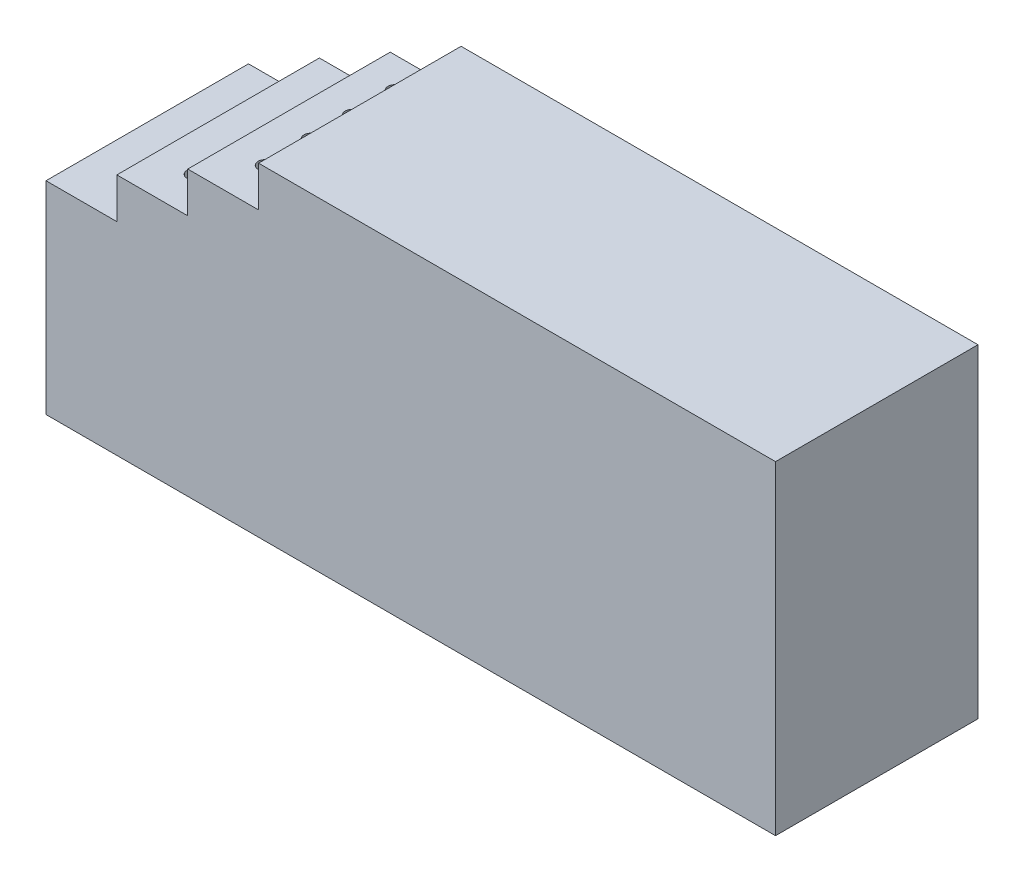
ISO-10303-21;
HEADER;
FILE_DESCRIPTION(('STEP AP214'),'2;1');
FILE_NAME('part.step','',(''),(''),'','','');
FILE_SCHEMA(('AUTOMOTIVE_DESIGN { 1 0 10303 214 1 1 1 1 }'));
ENDSEC;
DATA;
#1=APPLICATION_CONTEXT('core data for automotive mechanical design processes');
#2=APPLICATION_PROTOCOL_DEFINITION('international standard','automotive_design',2000,#1);
#3=PRODUCT_CONTEXT('',#1,'mechanical');
#4=PRODUCT('Part','Part','',(#3));
#5=PRODUCT_RELATED_PRODUCT_CATEGORY('part','',(#4));
#6=PRODUCT_DEFINITION_FORMATION('','',#4);
#7=PRODUCT_DEFINITION_CONTEXT('part definition',#1,'design');
#8=PRODUCT_DEFINITION('design','',#6,#7);
#9=PRODUCT_DEFINITION_SHAPE('','',#8);
#10=(LENGTH_UNIT() NAMED_UNIT(*) SI_UNIT(.MILLI.,.METRE.));
#11=(NAMED_UNIT(*) PLANE_ANGLE_UNIT() SI_UNIT($,.RADIAN.));
#12=(NAMED_UNIT(*) SI_UNIT($,.STERADIAN.) SOLID_ANGLE_UNIT());
#13=UNCERTAINTY_MEASURE_WITH_UNIT(LENGTH_MEASURE(1.E-05),#10,'distance_accuracy_value','');
#14=(GEOMETRIC_REPRESENTATION_CONTEXT(3) GLOBAL_UNCERTAINTY_ASSIGNED_CONTEXT((#13)) GLOBAL_UNIT_ASSIGNED_CONTEXT((#10,
#11,#12)) REPRESENTATION_CONTEXT('',''));
#15=CARTESIAN_POINT('',(0.,0.,0.));
#16=DIRECTION('',(0.,0.,1.));
#17=DIRECTION('',(1.,0.,0.));
#18=AXIS2_PLACEMENT_3D('',#15,#16,#17);
#19=CARTESIAN_POINT('',(0.,100.,-100.));
#20=DIRECTION('',(0.,0.,-1.));
#21=DIRECTION('',(-1.,0.,0.));
#22=AXIS2_PLACEMENT_3D('',#19,#20,#21);
#23=PLANE('',#22);
#24=DIRECTION('',(1.,0.,0.));
#25=VECTOR('',#24,1.);
#26=CARTESIAN_POINT('',(0.,0.,-100.));
#27=LINE('',#26,#25);
#28=CARTESIAN_POINT('',(0.,0.,-100.));
#29=VERTEX_POINT('',#28);
#30=CARTESIAN_POINT('',(360.279005498684,0.,-100.));
#31=VERTEX_POINT('',#30);
#32=EDGE_CURVE('E99',#29,#31,#27,.T.);
#33=ORIENTED_EDGE('',*,*,#32,.F.);
#34=DIRECTION('',(0.,-1.,0.));
#35=VECTOR('',#34,1.);
#36=CARTESIAN_POINT('',(0.,100.,-100.));
#37=LINE('',#36,#35);
#38=CARTESIAN_POINT('',(0.,100.,-100.));
#39=VERTEX_POINT('',#38);
#40=EDGE_CURVE('E11',#39,#29,#37,.T.);
#41=ORIENTED_EDGE('',*,*,#40,.F.);
#42=DIRECTION('',(1.,0.,0.));
#43=VECTOR('',#42,1.);
#44=CARTESIAN_POINT('',(0.,100.,-100.));
#45=LINE('',#44,#43);
#46=CARTESIAN_POINT('',(35.,100.,-100.));
#47=VERTEX_POINT('',#46);
#48=EDGE_CURVE('E82',#39,#47,#45,.T.);
#49=ORIENTED_EDGE('',*,*,#48,.T.);
#50=DIRECTION('',(0.,-1.,0.));
#51=VECTOR('',#50,1.);
#52=CARTESIAN_POINT('',(35.,120.,-100.));
#53=LINE('',#52,#51);
#54=CARTESIAN_POINT('',(35.,120.,-100.));
#55=VERTEX_POINT('',#54);
#56=EDGE_CURVE('E92',#55,#47,#53,.T.);
#57=ORIENTED_EDGE('',*,*,#56,.F.);
#58=DIRECTION('',(1.,0.,0.));
#59=VECTOR('',#58,1.);
#60=CARTESIAN_POINT('',(0.,120.,-100.));
#61=LINE('',#60,#59);
#62=CARTESIAN_POINT('',(70.,120.,-100.));
#63=VERTEX_POINT('',#62);
#64=EDGE_CURVE('E323',#55,#63,#61,.T.);
#65=ORIENTED_EDGE('',*,*,#64,.T.);
#66=DIRECTION('',(0.,-1.,0.));
#67=VECTOR('',#66,1.);
#68=CARTESIAN_POINT('',(70.,140.,-100.));
#69=LINE('',#68,#67);
#70=CARTESIAN_POINT('',(70.,140.,-100.));
#71=VERTEX_POINT('',#70);
#72=EDGE_CURVE('E317',#71,#63,#69,.T.);
#73=ORIENTED_EDGE('',*,*,#72,.F.);
#74=DIRECTION('',(1.,0.,0.));
#75=VECTOR('',#74,1.);
#76=CARTESIAN_POINT('',(0.,140.,-100.));
#77=LINE('',#76,#75);
#78=CARTESIAN_POINT('',(105.,140.,-100.));
#79=VERTEX_POINT('',#78);
#80=EDGE_CURVE('E305',#71,#79,#77,.T.);
#81=ORIENTED_EDGE('',*,*,#80,.T.);
#82=DIRECTION('',(0.,-1.,0.));
#83=VECTOR('',#82,1.);
#84=CARTESIAN_POINT('',(105.,160.,-100.));
#85=LINE('',#84,#83);
#86=CARTESIAN_POINT('',(105.,160.,-100.));
#87=VERTEX_POINT('',#86);
#88=EDGE_CURVE('E299',#87,#79,#85,.T.);
#89=ORIENTED_EDGE('',*,*,#88,.F.);
#90=DIRECTION('',(1.,0.,0.));
#91=VECTOR('',#90,1.);
#92=CARTESIAN_POINT('',(0.,160.,-100.));
#93=LINE('',#92,#91);
#94=CARTESIAN_POINT('',(360.279005498684,160.,-100.));
#95=VERTEX_POINT('',#94);
#96=EDGE_CURVE('E287',#87,#95,#93,.T.);
#97=ORIENTED_EDGE('',*,*,#96,.T.);
#98=DIRECTION('',(0.,-1.,0.));
#99=VECTOR('',#98,1.);
#100=CARTESIAN_POINT('',(360.279005498684,160.,-100.));
#101=LINE('',#100,#99);
#102=EDGE_CURVE('E281',#95,#31,#101,.T.);
#103=ORIENTED_EDGE('',*,*,#102,.T.);
#104=EDGE_LOOP('',(#33,#41,#49,#57,#65,#73,#81,#89,#97,#103));
#105=FACE_BOUND('',#104,.T.);
#106=ADVANCED_FACE('F42',(#105),#23,.T.);
#107=CARTESIAN_POINT('',(0.,100.,0.));
#108=DIRECTION('',(-1.,0.,0.));
#109=DIRECTION('',(0.,0.,1.));
#110=AXIS2_PLACEMENT_3D('',#107,#108,#109);
#111=PLANE('',#110);
#112=DIRECTION('',(0.,0.,-1.));
#113=VECTOR('',#112,1.);
#114=CARTESIAN_POINT('',(0.,0.,0.));
#115=LINE('',#114,#113);
#116=CARTESIAN_POINT('',(0.,0.,0.));
#117=VERTEX_POINT('',#116);
#118=EDGE_CURVE('E103',#117,#29,#115,.T.);
#119=ORIENTED_EDGE('',*,*,#118,.F.);
#120=DIRECTION('',(0.,-1.,0.));
#121=VECTOR('',#120,1.);
#122=CARTESIAN_POINT('',(0.,100.,0.));
#123=LINE('',#122,#121);
#124=CARTESIAN_POINT('',(0.,100.,0.));
#125=VERTEX_POINT('',#124);
#126=EDGE_CURVE('E50',#125,#117,#123,.T.);
#127=ORIENTED_EDGE('',*,*,#126,.F.);
#128=DIRECTION('',(0.,0.,-1.));
#129=VECTOR('',#128,1.);
#130=CARTESIAN_POINT('',(0.,100.,0.));
#131=LINE('',#130,#129);
#132=EDGE_CURVE('E94',#125,#39,#131,.T.);
#133=ORIENTED_EDGE('',*,*,#132,.T.);
#134=ORIENTED_EDGE('',*,*,#40,.T.);
#135=EDGE_LOOP('',(#119,#127,#133,#134));
#136=FACE_BOUND('',#135,.T.);
#137=ADVANCED_FACE('F125',(#136),#111,.T.);
#138=CARTESIAN_POINT('',(0.,100.,0.));
#139=DIRECTION('',(0.,0.,-1.));
#140=DIRECTION('',(-1.,0.,0.));
#141=AXIS2_PLACEMENT_3D('',#138,#139,#140);
#142=PLANE('',#141);
#143=DIRECTION('',(1.,0.,0.));
#144=VECTOR('',#143,1.);
#145=CARTESIAN_POINT('',(0.,0.,0.));
#146=LINE('',#145,#144);
#147=CARTESIAN_POINT('',(360.279005498684,0.,0.));
#148=VERTEX_POINT('',#147);
#149=EDGE_CURVE('E87',#117,#148,#146,.T.);
#150=ORIENTED_EDGE('',*,*,#149,.T.);
#151=DIRECTION('',(0.,-1.,0.));
#152=VECTOR('',#151,1.);
#153=CARTESIAN_POINT('',(360.279005498684,160.,0.));
#154=LINE('',#153,#152);
#155=CARTESIAN_POINT('',(360.279005498684,160.,0.));
#156=VERTEX_POINT('',#155);
#157=EDGE_CURVE('E285',#156,#148,#154,.T.);
#158=ORIENTED_EDGE('',*,*,#157,.F.);
#159=DIRECTION('',(1.,0.,0.));
#160=VECTOR('',#159,1.);
#161=CARTESIAN_POINT('',(0.,160.,0.));
#162=LINE('',#161,#160);
#163=CARTESIAN_POINT('',(105.,160.,0.));
#164=VERTEX_POINT('',#163);
#165=EDGE_CURVE('E293',#164,#156,#162,.T.);
#166=ORIENTED_EDGE('',*,*,#165,.F.);
#167=DIRECTION('',(0.,-1.,0.));
#168=VECTOR('',#167,1.);
#169=CARTESIAN_POINT('',(105.,160.,0.));
#170=LINE('',#169,#168);
#171=CARTESIAN_POINT('',(105.,140.,0.));
#172=VERTEX_POINT('',#171);
#173=EDGE_CURVE('E296',#164,#172,#170,.T.);
#174=ORIENTED_EDGE('',*,*,#173,.T.);
#175=DIRECTION('',(1.,0.,0.));
#176=VECTOR('',#175,1.);
#177=CARTESIAN_POINT('',(0.,140.,0.));
#178=LINE('',#177,#176);
#179=CARTESIAN_POINT('',(70.,140.,0.));
#180=VERTEX_POINT('',#179);
#181=EDGE_CURVE('E311',#180,#172,#178,.T.);
#182=ORIENTED_EDGE('',*,*,#181,.F.);
#183=DIRECTION('',(0.,-1.,0.));
#184=VECTOR('',#183,1.);
#185=CARTESIAN_POINT('',(70.,140.,0.));
#186=LINE('',#185,#184);
#187=CARTESIAN_POINT('',(70.,120.,0.));
#188=VERTEX_POINT('',#187);
#189=EDGE_CURVE('E314',#180,#188,#186,.T.);
#190=ORIENTED_EDGE('',*,*,#189,.T.);
#191=DIRECTION('',(1.,0.,0.));
#192=VECTOR('',#191,1.);
#193=CARTESIAN_POINT('',(0.,120.,0.));
#194=LINE('',#193,#192);
#195=CARTESIAN_POINT('',(35.,120.,0.));
#196=VERTEX_POINT('',#195);
#197=EDGE_CURVE('E105',#196,#188,#194,.T.);
#198=ORIENTED_EDGE('',*,*,#197,.F.);
#199=DIRECTION('',(0.,-1.,0.));
#200=VECTOR('',#199,1.);
#201=CARTESIAN_POINT('',(35.,120.,0.));
#202=LINE('',#201,#200);
#203=CARTESIAN_POINT('',(35.,100.,0.));
#204=VERTEX_POINT('',#203);
#205=EDGE_CURVE('E100',#196,#204,#202,.T.);
#206=ORIENTED_EDGE('',*,*,#205,.T.);
#207=DIRECTION('',(1.,0.,0.));
#208=VECTOR('',#207,1.);
#209=CARTESIAN_POINT('',(0.,100.,0.));
#210=LINE('',#209,#208);
#211=EDGE_CURVE('E72',#125,#204,#210,.T.);
#212=ORIENTED_EDGE('',*,*,#211,.F.);
#213=ORIENTED_EDGE('',*,*,#126,.T.);
#214=EDGE_LOOP('',(#150,#158,#166,#174,#182,#190,#198,#206,#212,#213));
#215=FACE_BOUND('',#214,.T.);
#216=ADVANCED_FACE('F116',(#215),#142,.F.);
#217=CARTESIAN_POINT('',(0.,100.,0.));
#218=DIRECTION('',(0.,1.,0.));
#219=DIRECTION('',(0.,0.,1.));
#220=AXIS2_PLACEMENT_3D('',#217,#218,#219);
#221=PLANE('',#220);
#222=DIRECTION('',(0.,0.,1.));
#223=VECTOR('',#222,1.);
#224=CARTESIAN_POINT('',(35.,100.,0.));
#225=LINE('',#224,#223);
#226=EDGE_CURVE('E79',#47,#204,#225,.T.);
#227=ORIENTED_EDGE('',*,*,#226,.F.);
#228=ORIENTED_EDGE('',*,*,#48,.F.);
#229=ORIENTED_EDGE('',*,*,#132,.F.);
#230=ORIENTED_EDGE('',*,*,#211,.T.);
#231=EDGE_LOOP('',(#227,#228,#229,#230));
#232=FACE_BOUND('',#231,.T.);
#233=ADVANCED_FACE('F81',(#232),#221,.T.);
#234=CARTESIAN_POINT('',(0.,0.,0.));
#235=DIRECTION('',(0.,1.,0.));
#236=DIRECTION('',(0.,0.,1.));
#237=AXIS2_PLACEMENT_3D('',#234,#235,#236);
#238=PLANE('',#237);
#239=ORIENTED_EDGE('',*,*,#32,.T.);
#240=DIRECTION('',(0.,0.,-1.));
#241=VECTOR('',#240,1.);
#242=CARTESIAN_POINT('',(360.279005498684,0.,0.));
#243=LINE('',#242,#241);
#244=EDGE_CURVE('E123',#148,#31,#243,.T.);
#245=ORIENTED_EDGE('',*,*,#244,.F.);
#246=ORIENTED_EDGE('',*,*,#149,.F.);
#247=ORIENTED_EDGE('',*,*,#118,.T.);
#248=EDGE_LOOP('',(#239,#245,#246,#247));
#249=FACE_BOUND('',#248,.T.);
#250=ADVANCED_FACE('F121',(#249),#238,.F.);
#251=CARTESIAN_POINT('',(35.,120.,0.));
#252=DIRECTION('',(1.,0.,0.));
#253=DIRECTION('',(0.,0.,-1.));
#254=AXIS2_PLACEMENT_3D('',#251,#252,#253);
#255=PLANE('',#254);
#256=ORIENTED_EDGE('',*,*,#56,.T.);
#257=ORIENTED_EDGE('',*,*,#226,.T.);
#258=ORIENTED_EDGE('',*,*,#205,.F.);
#259=DIRECTION('',(0.,0.,1.));
#260=VECTOR('',#259,1.);
#261=CARTESIAN_POINT('',(35.,120.,0.));
#262=LINE('',#261,#260);
#263=EDGE_CURVE('E97',#55,#196,#262,.T.);
#264=ORIENTED_EDGE('',*,*,#263,.F.);
#265=EDGE_LOOP('',(#256,#257,#258,#264));
#266=FACE_BOUND('',#265,.T.);
#267=ADVANCED_FACE('F96',(#266),#255,.F.);
#268=CARTESIAN_POINT('',(0.,120.,0.));
#269=DIRECTION('',(0.,1.,0.));
#270=DIRECTION('',(0.,0.,1.));
#271=AXIS2_PLACEMENT_3D('',#268,#269,#270);
#272=PLANE('',#271);
#273=CARTESIAN_POINT('',(53.8591113138978,120.,-83.4583906344508));
#274=DIRECTION('',(0.,1.,0.));
#275=DIRECTION('',(0.,0.,1.));
#276=AXIS2_PLACEMENT_3D('',#273,#274,#275);
#277=CIRCLE('',#276,3.5);
#278=CARTESIAN_POINT('',(53.8591113138978,120.,-79.9583906344508));
#279=VERTEX_POINT('',#278);
#280=EDGE_CURVE('E261',#279,#279,#277,.T.);
#281=ORIENTED_EDGE('',*,*,#280,.F.);
#282=EDGE_LOOP('',(#281));
#283=FACE_BOUND('',#282,.T.);
#284=CARTESIAN_POINT('',(53.8591113138978,120.,-62.3017455277091));
#285=DIRECTION('',(0.,1.,0.));
#286=DIRECTION('',(0.,0.,1.));
#287=AXIS2_PLACEMENT_3D('',#284,#285,#286);
#288=CIRCLE('',#287,3.5);
#289=CARTESIAN_POINT('',(53.8591113138978,120.,-58.8017455277091));
#290=VERTEX_POINT('',#289);
#291=EDGE_CURVE('E267',#290,#290,#288,.T.);
#292=ORIENTED_EDGE('',*,*,#291,.F.);
#293=EDGE_LOOP('',(#292));
#294=FACE_BOUND('',#293,.T.);
#295=CARTESIAN_POINT('',(53.8591113138978,120.,-41.9429086873788));
#296=DIRECTION('',(0.,1.,0.));
#297=DIRECTION('',(0.,0.,1.));
#298=AXIS2_PLACEMENT_3D('',#295,#296,#297);
#299=CIRCLE('',#298,3.5);
#300=CARTESIAN_POINT('',(53.8591113138978,120.,-38.4429086873788));
#301=VERTEX_POINT('',#300);
#302=EDGE_CURVE('E273',#301,#301,#299,.T.);
#303=ORIENTED_EDGE('',*,*,#302,.F.);
#304=EDGE_LOOP('',(#303));
#305=FACE_BOUND('',#304,.T.);
#306=CARTESIAN_POINT('',(53.8591113138978,120.,-19.3121407143733));
#307=DIRECTION('',(0.,1.,0.));
#308=DIRECTION('',(0.,0.,1.));
#309=AXIS2_PLACEMENT_3D('',#306,#307,#308);
#310=CIRCLE('',#309,3.5);
#311=CARTESIAN_POINT('',(53.8591113138978,120.,-15.8121407143733));
#312=VERTEX_POINT('',#311);
#313=EDGE_CURVE('E231',#312,#312,#310,.T.);
#314=ORIENTED_EDGE('',*,*,#313,.F.);
#315=EDGE_LOOP('',(#314));
#316=FACE_BOUND('',#315,.T.);
#317=DIRECTION('',(0.,0.,1.));
#318=VECTOR('',#317,1.);
#319=CARTESIAN_POINT('',(70.,120.,0.));
#320=LINE('',#319,#318);
#321=EDGE_CURVE('E320',#63,#188,#320,.T.);
#322=ORIENTED_EDGE('',*,*,#321,.F.);
#323=ORIENTED_EDGE('',*,*,#64,.F.);
#324=ORIENTED_EDGE('',*,*,#263,.T.);
#325=ORIENTED_EDGE('',*,*,#197,.T.);
#326=EDGE_LOOP('',(#322,#323,#324,#325));
#327=FACE_BOUND('',#326,.T.);
#328=ADVANCED_FACE('F139',(#283,#294,#305,#316,#327),#272,.T.);
#329=CARTESIAN_POINT('',(70.,140.,0.));
#330=DIRECTION('',(1.,0.,0.));
#331=DIRECTION('',(0.,0.,-1.));
#332=AXIS2_PLACEMENT_3D('',#329,#330,#331);
#333=PLANE('',#332);
#334=ORIENTED_EDGE('',*,*,#72,.T.);
#335=ORIENTED_EDGE('',*,*,#321,.T.);
#336=ORIENTED_EDGE('',*,*,#189,.F.);
#337=DIRECTION('',(0.,0.,1.));
#338=VECTOR('',#337,1.);
#339=CARTESIAN_POINT('',(70.,140.,0.));
#340=LINE('',#339,#338);
#341=EDGE_CURVE('E308',#71,#180,#340,.T.);
#342=ORIENTED_EDGE('',*,*,#341,.F.);
#343=EDGE_LOOP('',(#334,#335,#336,#342));
#344=FACE_BOUND('',#343,.T.);
#345=ADVANCED_FACE('F142',(#344),#333,.F.);
#346=CARTESIAN_POINT('',(0.,140.,0.));
#347=DIRECTION('',(0.,1.,0.));
#348=DIRECTION('',(0.,0.,1.));
#349=AXIS2_PLACEMENT_3D('',#346,#347,#348);
#350=PLANE('',#349);
#351=CARTESIAN_POINT('',(87.5721753587584,140.,-84.8535665178249));
#352=DIRECTION('',(0.,1.,0.));
#353=DIRECTION('',(0.,0.,1.));
#354=AXIS2_PLACEMENT_3D('',#351,#352,#353);
#355=CIRCLE('',#354,3.49999999999999);
#356=CARTESIAN_POINT('',(87.5721753587584,140.,-81.353566517825));
#357=VERTEX_POINT('',#356);
#358=EDGE_CURVE('E232',#357,#357,#355,.T.);
#359=ORIENTED_EDGE('',*,*,#358,.F.);
#360=EDGE_LOOP('',(#359));
#361=FACE_BOUND('',#360,.T.);
#362=CARTESIAN_POINT('',(87.5721753587584,140.,-63.6969214110832));
#363=DIRECTION('',(0.,1.,0.));
#364=DIRECTION('',(0.,0.,1.));
#365=AXIS2_PLACEMENT_3D('',#362,#363,#364);
#366=CIRCLE('',#365,3.49999999999999);
#367=CARTESIAN_POINT('',(87.5721753587584,140.,-60.1969214110832));
#368=VERTEX_POINT('',#367);
#369=EDGE_CURVE('E243',#368,#368,#366,.T.);
#370=ORIENTED_EDGE('',*,*,#369,.F.);
#371=EDGE_LOOP('',(#370));
#372=FACE_BOUND('',#371,.T.);
#373=CARTESIAN_POINT('',(87.5721753587584,140.,-43.3380845707529));
#374=DIRECTION('',(0.,1.,0.));
#375=DIRECTION('',(0.,0.,1.));
#376=AXIS2_PLACEMENT_3D('',#373,#374,#375);
#377=CIRCLE('',#376,3.49999999999999);
#378=CARTESIAN_POINT('',(87.5721753587584,140.,-39.8380845707529));
#379=VERTEX_POINT('',#378);
#380=EDGE_CURVE('E249',#379,#379,#377,.T.);
#381=ORIENTED_EDGE('',*,*,#380,.F.);
#382=EDGE_LOOP('',(#381));
#383=FACE_BOUND('',#382,.T.);
#384=CARTESIAN_POINT('',(87.5721753587584,140.,-20.7073165977474));
#385=DIRECTION('',(0.,1.,0.));
#386=DIRECTION('',(0.,0.,1.));
#387=AXIS2_PLACEMENT_3D('',#384,#385,#386);
#388=CIRCLE('',#387,3.49999999999999);
#389=CARTESIAN_POINT('',(87.5721753587584,140.,-17.2073165977474));
#390=VERTEX_POINT('',#389);
#391=EDGE_CURVE('E255',#390,#390,#388,.T.);
#392=ORIENTED_EDGE('',*,*,#391,.F.);
#393=EDGE_LOOP('',(#392));
#394=FACE_BOUND('',#393,.T.);
#395=DIRECTION('',(0.,0.,1.));
#396=VECTOR('',#395,1.);
#397=CARTESIAN_POINT('',(105.,140.,0.));
#398=LINE('',#397,#396);
#399=EDGE_CURVE('E302',#79,#172,#398,.T.);
#400=ORIENTED_EDGE('',*,*,#399,.F.);
#401=ORIENTED_EDGE('',*,*,#80,.F.);
#402=ORIENTED_EDGE('',*,*,#341,.T.);
#403=ORIENTED_EDGE('',*,*,#181,.T.);
#404=EDGE_LOOP('',(#400,#401,#402,#403));
#405=FACE_BOUND('',#404,.T.);
#406=ADVANCED_FACE('F146',(#361,#372,#383,#394,#405),#350,.T.);
#407=CARTESIAN_POINT('',(105.,160.,0.));
#408=DIRECTION('',(1.,0.,0.));
#409=DIRECTION('',(0.,0.,-1.));
#410=AXIS2_PLACEMENT_3D('',#407,#408,#409);
#411=PLANE('',#410);
#412=ORIENTED_EDGE('',*,*,#88,.T.);
#413=ORIENTED_EDGE('',*,*,#399,.T.);
#414=ORIENTED_EDGE('',*,*,#173,.F.);
#415=DIRECTION('',(0.,0.,1.));
#416=VECTOR('',#415,1.);
#417=CARTESIAN_POINT('',(105.,160.,0.));
#418=LINE('',#417,#416);
#419=EDGE_CURVE('E290',#87,#164,#418,.T.);
#420=ORIENTED_EDGE('',*,*,#419,.F.);
#421=EDGE_LOOP('',(#412,#413,#414,#420));
#422=FACE_BOUND('',#421,.T.);
#423=ADVANCED_FACE('F150',(#422),#411,.F.);
#424=CARTESIAN_POINT('',(0.,160.,0.));
#425=DIRECTION('',(0.,1.,0.));
#426=DIRECTION('',(0.,0.,1.));
#427=AXIS2_PLACEMENT_3D('',#424,#425,#426);
#428=PLANE('',#427);
#429=ORIENTED_EDGE('',*,*,#96,.F.);
#430=ORIENTED_EDGE('',*,*,#419,.T.);
#431=ORIENTED_EDGE('',*,*,#165,.T.);
#432=DIRECTION('',(0.,0.,-1.));
#433=VECTOR('',#432,1.);
#434=CARTESIAN_POINT('',(360.279005498684,160.,0.));
#435=LINE('',#434,#433);
#436=EDGE_CURVE('E278',#156,#95,#435,.T.);
#437=ORIENTED_EDGE('',*,*,#436,.T.);
#438=EDGE_LOOP('',(#429,#430,#431,#437));
#439=FACE_BOUND('',#438,.T.);
#440=ADVANCED_FACE('F154',(#439),#428,.T.);
#441=CARTESIAN_POINT('',(360.279005498684,160.,0.));
#442=DIRECTION('',(-1.,0.,0.));
#443=DIRECTION('',(0.,0.,1.));
#444=AXIS2_PLACEMENT_3D('',#441,#442,#443);
#445=PLANE('',#444);
#446=ORIENTED_EDGE('',*,*,#244,.T.);
#447=ORIENTED_EDGE('',*,*,#102,.F.);
#448=ORIENTED_EDGE('',*,*,#436,.F.);
#449=ORIENTED_EDGE('',*,*,#157,.T.);
#450=EDGE_LOOP('',(#446,#447,#448,#449));
#451=FACE_BOUND('',#450,.T.);
#452=ADVANCED_FACE('F158',(#451),#445,.F.);
#453=CARTESIAN_POINT('',(53.8591113138978,95.,-19.3121407143733));
#454=DIRECTION('',(0.,1.,0.));
#455=DIRECTION('',(0.,0.,1.));
#456=AXIS2_PLACEMENT_3D('',#453,#454,#455);
#457=CYLINDRICAL_SURFACE('',#456,3.5);
#458=CARTESIAN_POINT('',(53.8591113138978,95.,-19.3121407143733));
#459=DIRECTION('',(0.,1.,0.));
#460=DIRECTION('',(0.,0.,1.));
#461=AXIS2_PLACEMENT_3D('',#458,#459,#460);
#462=CIRCLE('',#461,3.5);
#463=CARTESIAN_POINT('',(53.8591113138978,95.,-15.8121407143733));
#464=VERTEX_POINT('',#463);
#465=EDGE_CURVE('E235',#464,#464,#462,.T.);
#466=ORIENTED_EDGE('',*,*,#465,.F.);
#467=EDGE_LOOP('',(#466));
#468=FACE_BOUND('',#467,.T.);
#469=ORIENTED_EDGE('',*,*,#313,.T.);
#470=EDGE_LOOP('',(#469));
#471=FACE_BOUND('',#470,.T.);
#472=ADVANCED_FACE('F162',(#468,#471),#457,.F.);
#473=CARTESIAN_POINT('',(53.8591113138978,95.,-19.3121407143733));
#474=DIRECTION('',(0.,1.,0.));
#475=DIRECTION('',(0.,0.,1.));
#476=AXIS2_PLACEMENT_3D('',#473,#474,#475);
#477=PLANE('',#476);
#478=ORIENTED_EDGE('',*,*,#465,.T.);
#479=EDGE_LOOP('',(#478));
#480=FACE_BOUND('',#479,.T.);
#481=ADVANCED_FACE('F166',(#480),#477,.T.);
#482=CARTESIAN_POINT('',(53.8591113138978,95.,-41.9429086873788));
#483=DIRECTION('',(0.,1.,0.));
#484=DIRECTION('',(0.,0.,1.));
#485=AXIS2_PLACEMENT_3D('',#482,#483,#484);
#486=CYLINDRICAL_SURFACE('',#485,3.5);
#487=CARTESIAN_POINT('',(53.8591113138978,95.,-41.9429086873788));
#488=DIRECTION('',(0.,1.,0.));
#489=DIRECTION('',(0.,0.,1.));
#490=AXIS2_PLACEMENT_3D('',#487,#488,#489);
#491=CIRCLE('',#490,3.5);
#492=CARTESIAN_POINT('',(53.8591113138978,95.,-38.4429086873788));
#493=VERTEX_POINT('',#492);
#494=EDGE_CURVE('E270',#493,#493,#491,.T.);
#495=ORIENTED_EDGE('',*,*,#494,.F.);
#496=EDGE_LOOP('',(#495));
#497=FACE_BOUND('',#496,.T.);
#498=ORIENTED_EDGE('',*,*,#302,.T.);
#499=EDGE_LOOP('',(#498));
#500=FACE_BOUND('',#499,.T.);
#501=ADVANCED_FACE('F170',(#497,#500),#486,.F.);
#502=CARTESIAN_POINT('',(53.8591113138978,95.,-41.9429086873788));
#503=DIRECTION('',(0.,1.,0.));
#504=DIRECTION('',(0.,0.,1.));
#505=AXIS2_PLACEMENT_3D('',#502,#503,#504);
#506=PLANE('',#505);
#507=ORIENTED_EDGE('',*,*,#494,.T.);
#508=EDGE_LOOP('',(#507));
#509=FACE_BOUND('',#508,.T.);
#510=ADVANCED_FACE('F174',(#509),#506,.T.);
#511=CARTESIAN_POINT('',(53.8591113138978,95.,-62.3017455277091));
#512=DIRECTION('',(0.,1.,0.));
#513=DIRECTION('',(0.,0.,1.));
#514=AXIS2_PLACEMENT_3D('',#511,#512,#513);
#515=CYLINDRICAL_SURFACE('',#514,3.5);
#516=CARTESIAN_POINT('',(53.8591113138978,95.,-62.3017455277091));
#517=DIRECTION('',(0.,1.,0.));
#518=DIRECTION('',(0.,0.,1.));
#519=AXIS2_PLACEMENT_3D('',#516,#517,#518);
#520=CIRCLE('',#519,3.5);
#521=CARTESIAN_POINT('',(53.8591113138978,95.,-58.8017455277091));
#522=VERTEX_POINT('',#521);
#523=EDGE_CURVE('E264',#522,#522,#520,.T.);
#524=ORIENTED_EDGE('',*,*,#523,.F.);
#525=EDGE_LOOP('',(#524));
#526=FACE_BOUND('',#525,.T.);
#527=ORIENTED_EDGE('',*,*,#291,.T.);
#528=EDGE_LOOP('',(#527));
#529=FACE_BOUND('',#528,.T.);
#530=ADVANCED_FACE('F178',(#526,#529),#515,.F.);
#531=CARTESIAN_POINT('',(53.8591113138978,95.,-62.3017455277091));
#532=DIRECTION('',(0.,1.,0.));
#533=DIRECTION('',(0.,0.,1.));
#534=AXIS2_PLACEMENT_3D('',#531,#532,#533);
#535=PLANE('',#534);
#536=ORIENTED_EDGE('',*,*,#523,.T.);
#537=EDGE_LOOP('',(#536));
#538=FACE_BOUND('',#537,.T.);
#539=ADVANCED_FACE('F182',(#538),#535,.T.);
#540=CARTESIAN_POINT('',(53.8591113138978,95.,-83.4583906344508));
#541=DIRECTION('',(0.,1.,0.));
#542=DIRECTION('',(0.,0.,1.));
#543=AXIS2_PLACEMENT_3D('',#540,#541,#542);
#544=CYLINDRICAL_SURFACE('',#543,3.5);
#545=CARTESIAN_POINT('',(53.8591113138978,95.,-83.4583906344508));
#546=DIRECTION('',(0.,1.,0.));
#547=DIRECTION('',(0.,0.,1.));
#548=AXIS2_PLACEMENT_3D('',#545,#546,#547);
#549=CIRCLE('',#548,3.5);
#550=CARTESIAN_POINT('',(53.8591113138978,95.,-79.9583906344508));
#551=VERTEX_POINT('',#550);
#552=EDGE_CURVE('E258',#551,#551,#549,.T.);
#553=ORIENTED_EDGE('',*,*,#552,.F.);
#554=EDGE_LOOP('',(#553));
#555=FACE_BOUND('',#554,.T.);
#556=ORIENTED_EDGE('',*,*,#280,.T.);
#557=EDGE_LOOP('',(#556));
#558=FACE_BOUND('',#557,.T.);
#559=ADVANCED_FACE('F186',(#555,#558),#544,.F.);
#560=CARTESIAN_POINT('',(53.8591113138978,95.,-83.4583906344508));
#561=DIRECTION('',(0.,1.,0.));
#562=DIRECTION('',(0.,0.,1.));
#563=AXIS2_PLACEMENT_3D('',#560,#561,#562);
#564=PLANE('',#563);
#565=ORIENTED_EDGE('',*,*,#552,.T.);
#566=EDGE_LOOP('',(#565));
#567=FACE_BOUND('',#566,.T.);
#568=ADVANCED_FACE('F190',(#567),#564,.T.);
#569=CARTESIAN_POINT('',(87.5721753587584,115.,-20.7073165977474));
#570=DIRECTION('',(0.,1.,0.));
#571=DIRECTION('',(0.,0.,1.));
#572=AXIS2_PLACEMENT_3D('',#569,#570,#571);
#573=CYLINDRICAL_SURFACE('',#572,3.49999999999999);
#574=CARTESIAN_POINT('',(87.5721753587584,115.,-20.7073165977474));
#575=DIRECTION('',(0.,1.,0.));
#576=DIRECTION('',(0.,0.,1.));
#577=AXIS2_PLACEMENT_3D('',#574,#575,#576);
#578=CIRCLE('',#577,3.49999999999999);
#579=CARTESIAN_POINT('',(87.5721753587584,115.,-17.2073165977474));
#580=VERTEX_POINT('',#579);
#581=EDGE_CURVE('E252',#580,#580,#578,.T.);
#582=ORIENTED_EDGE('',*,*,#581,.F.);
#583=EDGE_LOOP('',(#582));
#584=FACE_BOUND('',#583,.T.);
#585=ORIENTED_EDGE('',*,*,#391,.T.);
#586=EDGE_LOOP('',(#585));
#587=FACE_BOUND('',#586,.T.);
#588=ADVANCED_FACE('F194',(#584,#587),#573,.F.);
#589=CARTESIAN_POINT('',(87.5721753587584,115.,-20.7073165977474));
#590=DIRECTION('',(0.,1.,0.));
#591=DIRECTION('',(0.,0.,1.));
#592=AXIS2_PLACEMENT_3D('',#589,#590,#591);
#593=PLANE('',#592);
#594=ORIENTED_EDGE('',*,*,#581,.T.);
#595=EDGE_LOOP('',(#594));
#596=FACE_BOUND('',#595,.T.);
#597=ADVANCED_FACE('F198',(#596),#593,.T.);
#598=CARTESIAN_POINT('',(87.5721753587584,115.,-43.3380845707529));
#599=DIRECTION('',(0.,1.,0.));
#600=DIRECTION('',(0.,0.,1.));
#601=AXIS2_PLACEMENT_3D('',#598,#599,#600);
#602=CYLINDRICAL_SURFACE('',#601,3.49999999999999);
#603=CARTESIAN_POINT('',(87.5721753587584,115.,-43.3380845707529));
#604=DIRECTION('',(0.,1.,0.));
#605=DIRECTION('',(0.,0.,1.));
#606=AXIS2_PLACEMENT_3D('',#603,#604,#605);
#607=CIRCLE('',#606,3.49999999999999);
#608=CARTESIAN_POINT('',(87.5721753587584,115.,-39.8380845707529));
#609=VERTEX_POINT('',#608);
#610=EDGE_CURVE('E246',#609,#609,#607,.T.);
#611=ORIENTED_EDGE('',*,*,#610,.F.);
#612=EDGE_LOOP('',(#611));
#613=FACE_BOUND('',#612,.T.);
#614=ORIENTED_EDGE('',*,*,#380,.T.);
#615=EDGE_LOOP('',(#614));
#616=FACE_BOUND('',#615,.T.);
#617=ADVANCED_FACE('F202',(#613,#616),#602,.F.);
#618=CARTESIAN_POINT('',(87.5721753587584,115.,-43.3380845707529));
#619=DIRECTION('',(0.,1.,0.));
#620=DIRECTION('',(0.,0.,1.));
#621=AXIS2_PLACEMENT_3D('',#618,#619,#620);
#622=PLANE('',#621);
#623=ORIENTED_EDGE('',*,*,#610,.T.);
#624=EDGE_LOOP('',(#623));
#625=FACE_BOUND('',#624,.T.);
#626=ADVANCED_FACE('F206',(#625),#622,.T.);
#627=CARTESIAN_POINT('',(87.5721753587584,115.,-63.6969214110832));
#628=DIRECTION('',(0.,1.,0.));
#629=DIRECTION('',(0.,0.,1.));
#630=AXIS2_PLACEMENT_3D('',#627,#628,#629);
#631=CYLINDRICAL_SURFACE('',#630,3.49999999999999);
#632=CARTESIAN_POINT('',(87.5721753587584,115.,-63.6969214110832));
#633=DIRECTION('',(0.,1.,0.));
#634=DIRECTION('',(0.,0.,1.));
#635=AXIS2_PLACEMENT_3D('',#632,#633,#634);
#636=CIRCLE('',#635,3.49999999999999);
#637=CARTESIAN_POINT('',(87.5721753587584,115.,-60.1969214110832));
#638=VERTEX_POINT('',#637);
#639=EDGE_CURVE('E238',#638,#638,#636,.T.);
#640=ORIENTED_EDGE('',*,*,#639,.F.);
#641=EDGE_LOOP('',(#640));
#642=FACE_BOUND('',#641,.T.);
#643=ORIENTED_EDGE('',*,*,#369,.T.);
#644=EDGE_LOOP('',(#643));
#645=FACE_BOUND('',#644,.T.);
#646=ADVANCED_FACE('F210',(#642,#645),#631,.F.);
#647=CARTESIAN_POINT('',(87.5721753587584,115.,-63.6969214110832));
#648=DIRECTION('',(0.,1.,0.));
#649=DIRECTION('',(0.,0.,1.));
#650=AXIS2_PLACEMENT_3D('',#647,#648,#649);
#651=PLANE('',#650);
#652=ORIENTED_EDGE('',*,*,#639,.T.);
#653=EDGE_LOOP('',(#652));
#654=FACE_BOUND('',#653,.T.);
#655=ADVANCED_FACE('F214',(#654),#651,.T.);
#656=CARTESIAN_POINT('',(87.5721753587584,115.,-84.8535665178249));
#657=DIRECTION('',(0.,1.,0.));
#658=DIRECTION('',(0.,0.,1.));
#659=AXIS2_PLACEMENT_3D('',#656,#657,#658);
#660=CYLINDRICAL_SURFACE('',#659,3.49999999999999);
#661=CARTESIAN_POINT('',(87.5721753587584,115.,-84.8535665178249));
#662=DIRECTION('',(0.,1.,0.));
#663=DIRECTION('',(0.,0.,1.));
#664=AXIS2_PLACEMENT_3D('',#661,#662,#663);
#665=CIRCLE('',#664,3.49999999999999);
#666=CARTESIAN_POINT('',(87.5721753587584,115.,-81.353566517825));
#667=VERTEX_POINT('',#666);
#668=EDGE_CURVE('E230',#667,#667,#665,.T.);
#669=ORIENTED_EDGE('',*,*,#668,.F.);
#670=EDGE_LOOP('',(#669));
#671=FACE_BOUND('',#670,.T.);
#672=ORIENTED_EDGE('',*,*,#358,.T.);
#673=EDGE_LOOP('',(#672));
#674=FACE_BOUND('',#673,.T.);
#675=ADVANCED_FACE('F218',(#671,#674),#660,.F.);
#676=CARTESIAN_POINT('',(87.5721753587584,115.,-84.8535665178249));
#677=DIRECTION('',(0.,1.,0.));
#678=DIRECTION('',(0.,0.,1.));
#679=AXIS2_PLACEMENT_3D('',#676,#677,#678);
#680=PLANE('',#679);
#681=ORIENTED_EDGE('',*,*,#668,.T.);
#682=EDGE_LOOP('',(#681));
#683=FACE_BOUND('',#682,.T.);
#684=ADVANCED_FACE('F222',(#683),#680,.T.);
#685=CLOSED_SHELL('',(#106,#137,#216,#233,#250,#267,#328,#345,#406,#423,#440,#452,#472,#481,
#501,#510,#530,#539,#559,#568,#588,#597,#617,#626,#646,#655,#675,#684));
#686=MANIFOLD_SOLID_BREP('B2',#685);
#687=ADVANCED_BREP_SHAPE_REPRESENTATION('',(#18,#686),#14);
#688=SHAPE_DEFINITION_REPRESENTATION(#9,#687);
ENDSEC;
END-ISO-10303-21;
